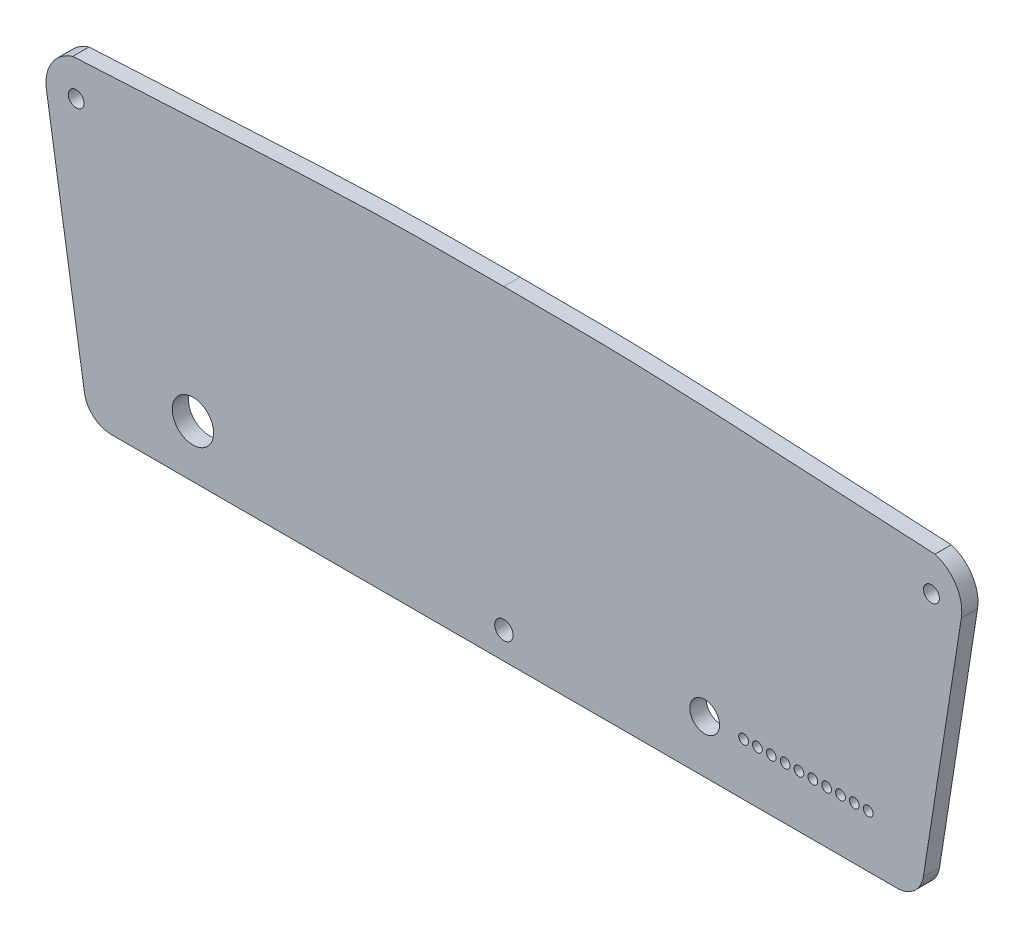
ISO-10303-21;
HEADER;
FILE_DESCRIPTION(('STEP AP214'),'2;1');
FILE_NAME('part.step','',(''),(''),'','','');
FILE_SCHEMA(('AUTOMOTIVE_DESIGN { 1 0 10303 214 1 1 1 1 }'));
ENDSEC;
DATA;
#1=APPLICATION_CONTEXT('core data for automotive mechanical design processes');
#2=APPLICATION_PROTOCOL_DEFINITION('international standard','automotive_design',2000,#1);
#3=PRODUCT_CONTEXT('',#1,'mechanical');
#4=PRODUCT('Part','Part','',(#3));
#5=PRODUCT_RELATED_PRODUCT_CATEGORY('part','',(#4));
#6=PRODUCT_DEFINITION_FORMATION('','',#4);
#7=PRODUCT_DEFINITION_CONTEXT('part definition',#1,'design');
#8=PRODUCT_DEFINITION('design','',#6,#7);
#9=PRODUCT_DEFINITION_SHAPE('','',#8);
#10=(LENGTH_UNIT() NAMED_UNIT(*) SI_UNIT(.MILLI.,.METRE.));
#11=(NAMED_UNIT(*) PLANE_ANGLE_UNIT() SI_UNIT($,.RADIAN.));
#12=(NAMED_UNIT(*) SI_UNIT($,.STERADIAN.) SOLID_ANGLE_UNIT());
#13=UNCERTAINTY_MEASURE_WITH_UNIT(LENGTH_MEASURE(1.E-05),#10,'distance_accuracy_value','');
#14=(GEOMETRIC_REPRESENTATION_CONTEXT(3) GLOBAL_UNCERTAINTY_ASSIGNED_CONTEXT((#13)) GLOBAL_UNIT_ASSIGNED_CONTEXT((#10,
#11,#12)) REPRESENTATION_CONTEXT('',''));
#15=CARTESIAN_POINT('',(0.,0.,0.));
#16=DIRECTION('',(0.,0.,1.));
#17=DIRECTION('',(1.,0.,0.));
#18=AXIS2_PLACEMENT_3D('',#15,#16,#17);
#19=CARTESIAN_POINT('',(77.6729384432531,7.59154105312176,0.));
#20=DIRECTION('',(0.,0.,1.));
#21=DIRECTION('',(1.,0.,0.));
#22=AXIS2_PLACEMENT_3D('',#19,#20,#21);
#23=PLANE('',#22);
#24=CARTESIAN_POINT('',(-57.4968243381377,-33.0147357689466,0.));
#25=DIRECTION('',(0.,0.,1.));
#26=DIRECTION('',(1.,0.,0.));
#27=AXIS2_PLACEMENT_3D('',#24,#25,#26);
#28=CIRCLE('',#27,3.825);
#29=CARTESIAN_POINT('',(-53.6718243381377,-33.0147357689466,0.));
#30=VERTEX_POINT('',#29);
#31=EDGE_CURVE('E336',#30,#30,#28,.T.);
#32=ORIENTED_EDGE('',*,*,#31,.T.);
#33=EDGE_LOOP('',(#32));
#34=FACE_BOUND('',#33,.T.);
#35=CARTESIAN_POINT('',(44.3221642694553,-33.0147357689466,0.));
#36=DIRECTION('',(0.,0.,-1.));
#37=DIRECTION('',(-1.,0.,0.));
#38=AXIS2_PLACEMENT_3D('',#35,#36,#37);
#39=CIRCLE('',#38,0.899999999999998);
#40=CARTESIAN_POINT('',(43.4221642694553,-33.0147357689466,0.));
#41=VERTEX_POINT('',#40);
#42=EDGE_CURVE('E333',#41,#41,#39,.T.);
#43=ORIENTED_EDGE('',*,*,#42,.F.);
#44=EDGE_LOOP('',(#43));
#45=FACE_BOUND('',#44,.T.);
#46=CARTESIAN_POINT('',(46.8821642694554,-33.0147357689466,0.));
#47=DIRECTION('',(0.,0.,-1.));
#48=DIRECTION('',(-1.,0.,0.));
#49=AXIS2_PLACEMENT_3D('',#46,#47,#48);
#50=CIRCLE('',#49,0.899999999999998);
#51=CARTESIAN_POINT('',(45.9821642694554,-33.0147357689466,0.));
#52=VERTEX_POINT('',#51);
#53=EDGE_CURVE('E327',#52,#52,#50,.T.);
#54=ORIENTED_EDGE('',*,*,#53,.F.);
#55=EDGE_LOOP('',(#54));
#56=FACE_BOUND('',#55,.T.);
#57=CARTESIAN_POINT('',(52.0021642694553,-33.0147357689466,0.));
#58=DIRECTION('',(0.,0.,-1.));
#59=DIRECTION('',(-1.,0.,0.));
#60=AXIS2_PLACEMENT_3D('',#57,#58,#59);
#61=CIRCLE('',#60,0.899999999999998);
#62=CARTESIAN_POINT('',(51.1021642694553,-33.0147357689466,0.));
#63=VERTEX_POINT('',#62);
#64=EDGE_CURVE('E315',#63,#63,#61,.T.);
#65=ORIENTED_EDGE('',*,*,#64,.F.);
#66=EDGE_LOOP('',(#65));
#67=FACE_BOUND('',#66,.T.);
#68=CARTESIAN_POINT('',(54.5621642694553,-33.0147357689466,0.));
#69=DIRECTION('',(0.,0.,-1.));
#70=DIRECTION('',(-1.,0.,0.));
#71=AXIS2_PLACEMENT_3D('',#68,#69,#70);
#72=CIRCLE('',#71,0.899999999999998);
#73=CARTESIAN_POINT('',(53.6621642694553,-33.0147357689466,0.));
#74=VERTEX_POINT('',#73);
#75=EDGE_CURVE('E309',#74,#74,#72,.T.);
#76=ORIENTED_EDGE('',*,*,#75,.F.);
#77=EDGE_LOOP('',(#76));
#78=FACE_BOUND('',#77,.T.);
#79=CARTESIAN_POINT('',(57.1221642694553,-33.0147357689466,0.));
#80=DIRECTION('',(0.,0.,-1.));
#81=DIRECTION('',(-1.,0.,0.));
#82=AXIS2_PLACEMENT_3D('',#79,#80,#81);
#83=CIRCLE('',#82,0.899999999999998);
#84=CARTESIAN_POINT('',(56.2221642694554,-33.0147357689466,0.));
#85=VERTEX_POINT('',#84);
#86=EDGE_CURVE('E303',#85,#85,#83,.T.);
#87=ORIENTED_EDGE('',*,*,#86,.F.);
#88=EDGE_LOOP('',(#87));
#89=FACE_BOUND('',#88,.T.);
#90=CARTESIAN_POINT('',(59.6821642694553,-33.0147357689466,0.));
#91=DIRECTION('',(0.,0.,-1.));
#92=DIRECTION('',(-1.,0.,0.));
#93=AXIS2_PLACEMENT_3D('',#90,#91,#92);
#94=CIRCLE('',#93,0.899999999999998);
#95=CARTESIAN_POINT('',(58.7821642694554,-33.0147357689466,0.));
#96=VERTEX_POINT('',#95);
#97=EDGE_CURVE('E297',#96,#96,#94,.T.);
#98=ORIENTED_EDGE('',*,*,#97,.F.);
#99=EDGE_LOOP('',(#98));
#100=FACE_BOUND('',#99,.T.);
#101=CARTESIAN_POINT('',(62.2421642694554,-33.0147357689466,0.));
#102=DIRECTION('',(0.,0.,-1.));
#103=DIRECTION('',(-1.,0.,0.));
#104=AXIS2_PLACEMENT_3D('',#101,#102,#103);
#105=CIRCLE('',#104,0.900000000000005);
#106=CARTESIAN_POINT('',(61.3421642694554,-33.0147357689466,0.));
#107=VERTEX_POINT('',#106);
#108=EDGE_CURVE('E291',#107,#107,#105,.T.);
#109=ORIENTED_EDGE('',*,*,#108,.F.);
#110=EDGE_LOOP('',(#109));
#111=FACE_BOUND('',#110,.T.);
#112=CARTESIAN_POINT('',(67.3621642694553,-33.0147357689466,0.));
#113=DIRECTION('',(0.,0.,-1.));
#114=DIRECTION('',(-1.,0.,0.));
#115=AXIS2_PLACEMENT_3D('',#112,#113,#114);
#116=CIRCLE('',#115,0.899999999999998);
#117=CARTESIAN_POINT('',(66.4621642694554,-33.0147357689466,0.));
#118=VERTEX_POINT('',#117);
#119=EDGE_CURVE('E279',#118,#118,#116,.T.);
#120=ORIENTED_EDGE('',*,*,#119,.F.);
#121=EDGE_LOOP('',(#120));
#122=FACE_BOUND('',#121,.T.);
#123=CARTESIAN_POINT('',(37.1256647541517,-33.0147357689466,0.));
#124=DIRECTION('',(0.,0.,-1.));
#125=DIRECTION('',(-1.,0.,0.));
#126=AXIS2_PLACEMENT_3D('',#123,#124,#125);
#127=CIRCLE('',#126,2.75);
#128=CARTESIAN_POINT('',(34.3756647541517,-33.0147357689466,0.));
#129=VERTEX_POINT('',#128);
#130=EDGE_CURVE('E273',#129,#129,#127,.T.);
#131=ORIENTED_EDGE('',*,*,#130,.F.);
#132=EDGE_LOOP('',(#131));
#133=FACE_BOUND('',#132,.T.);
#134=CARTESIAN_POINT('',(-79.0964854551997,7.80060452720228,0.));
#135=DIRECTION('',(0.,0.,-1.));
#136=DIRECTION('',(-1.,0.,0.));
#137=AXIS2_PLACEMENT_3D('',#134,#135,#136);
#138=CIRCLE('',#137,1.46049999999999);
#139=CARTESIAN_POINT('',(-80.5569854551997,7.80060452720228,0.));
#140=VERTEX_POINT('',#139);
#141=EDGE_CURVE('E261',#140,#140,#138,.T.);
#142=ORIENTED_EDGE('',*,*,#141,.F.);
#143=EDGE_LOOP('',(#142));
#144=FACE_BOUND('',#143,.T.);
#145=CARTESIAN_POINT('',(79.0662246228495,7.60685909853357,0.));
#146=DIRECTION('',(0.,0.,-1.));
#147=DIRECTION('',(-1.,0.,0.));
#148=AXIS2_PLACEMENT_3D('',#145,#146,#147);
#149=CIRCLE('',#148,1.46049999999999);
#150=CARTESIAN_POINT('',(77.6057246228496,7.60685909853357,0.));
#151=VERTEX_POINT('',#150);
#152=EDGE_CURVE('E255',#151,#151,#149,.T.);
#153=ORIENTED_EDGE('',*,*,#152,.F.);
#154=EDGE_LOOP('',(#153));
#155=FACE_BOUND('',#154,.T.);
#156=CARTESIAN_POINT('',(77.6729384432531,7.59154105312176,0.));
#157=DIRECTION('',(0.,0.,1.));
#158=DIRECTION('',(1.,0.,0.));
#159=AXIS2_PLACEMENT_3D('',#156,#157,#158);
#160=CIRCLE('',#159,7.);
#161=CARTESIAN_POINT('',(84.5890874100609,6.51131724810564,0.));
#162=VERTEX_POINT('',#161);
#163=CARTESIAN_POINT('',(79.7182282278267,14.2860753683015,0.));
#164=VERTEX_POINT('',#163);
#165=EDGE_CURVE('E136',#162,#164,#160,.T.);
#166=ORIENTED_EDGE('',*,*,#165,.F.);
#167=DIRECTION('',(0.154317686430875,0.988021280972542,0.));
#168=VECTOR('',#167,1.);
#169=CARTESIAN_POINT('',(77.5610943048627,-38.4855130638528,0.));
#170=LINE('',#169,#168);
#171=CARTESIAN_POINT('',(77.5610943048627,-38.4855130638528,0.));
#172=VERTEX_POINT('',#171);
#173=EDGE_CURVE('E84',#172,#162,#170,.T.);
#174=ORIENTED_EDGE('',*,*,#173,.F.);
#175=CARTESIAN_POINT('',(72.6209879,-37.7139246316985,0.));
#176=DIRECTION('',(0.,0.,-1.));
#177=DIRECTION('',(-1.,0.,0.));
#178=AXIS2_PLACEMENT_3D('',#175,#176,#177);
#179=CIRCLE('',#178,5.00000000000001);
#180=CARTESIAN_POINT('',(72.6209879,-42.7139246316985,0.));
#181=VERTEX_POINT('',#180);
#182=EDGE_CURVE('E166',#172,#181,#179,.T.);
#183=ORIENTED_EDGE('',*,*,#182,.T.);
#184=DIRECTION('',(-1.,0.,0.));
#185=VECTOR('',#184,1.);
#186=CARTESIAN_POINT('',(72.6209879,-42.7139246316985,0.));
#187=LINE('',#186,#185);
#188=CARTESIAN_POINT('',(-72.6209879,-42.7139246316985,0.));
#189=VERTEX_POINT('',#188);
#190=EDGE_CURVE('E115',#181,#189,#187,.T.);
#191=ORIENTED_EDGE('',*,*,#190,.T.);
#192=CARTESIAN_POINT('',(-72.6209879,-37.7139246316985,0.));
#193=DIRECTION('',(0.,0.,1.));
#194=DIRECTION('',(1.,0.,0.));
#195=AXIS2_PLACEMENT_3D('',#192,#193,#194);
#196=CIRCLE('',#195,5.00000000000001);
#197=CARTESIAN_POINT('',(-77.5610943048627,-38.4855130638528,0.));
#198=VERTEX_POINT('',#197);
#199=EDGE_CURVE('E162',#198,#189,#196,.T.);
#200=ORIENTED_EDGE('',*,*,#199,.F.);
#201=DIRECTION('',(-0.154317686430875,0.988021280972542,0.));
#202=VECTOR('',#201,1.);
#203=CARTESIAN_POINT('',(-77.5610943048627,-38.4855130638528,0.));
#204=LINE('',#203,#202);
#205=CARTESIAN_POINT('',(-84.5890874100609,6.51131724810564,0.));
#206=VERTEX_POINT('',#205);
#207=EDGE_CURVE('E159',#198,#206,#204,.T.);
#208=ORIENTED_EDGE('',*,*,#207,.T.);
#209=CARTESIAN_POINT('',(-77.6729384432531,7.59154105312176,0.));
#210=DIRECTION('',(0.,0.,-1.));
#211=DIRECTION('',(-1.,0.,0.));
#212=AXIS2_PLACEMENT_3D('',#209,#210,#211);
#213=CIRCLE('',#212,7.);
#214=CARTESIAN_POINT('',(-79.7182282278267,14.2860753683015,0.));
#215=VERTEX_POINT('',#214);
#216=EDGE_CURVE('E153',#206,#215,#213,.T.);
#217=ORIENTED_EDGE('',*,*,#216,.T.);
#218=CARTESIAN_POINT('',(-79.7182282278267,14.2860753683015,0.));
#219=CARTESIAN_POINT('',(-25.,17.2860753683015,0.));
#220=CARTESIAN_POINT('',(0.,17.2860753683015,0.));
#221=(BOUNDED_CURVE() B_SPLINE_CURVE(2,(#218,#219,#220),.UNSPECIFIED.,.F.,
.F.) B_SPLINE_CURVE_WITH_KNOTS((3,3),(0.,1.),
.UNSPECIFIED.) CURVE() GEOMETRIC_REPRESENTATION_ITEM() RATIONAL_B_SPLINE_CURVE((1.,3.,1.)) REPRESENTATION_ITEM(''));
#222=CARTESIAN_POINT('',(0.,17.2860753683015,0.));
#223=VERTEX_POINT('',#222);
#224=EDGE_CURVE('E145',#215,#223,#221,.T.);
#225=ORIENTED_EDGE('',*,*,#224,.T.);
#226=CARTESIAN_POINT('',(79.7182282278267,14.2860753683015,0.));
#227=CARTESIAN_POINT('',(25.,17.2860753683015,0.));
#228=CARTESIAN_POINT('',(0.,17.2860753683015,0.));
#229=(BOUNDED_CURVE() B_SPLINE_CURVE(2,(#226,#227,#228),.UNSPECIFIED.,.F.,
.F.) B_SPLINE_CURVE_WITH_KNOTS((3,3),(0.,1.),
.UNSPECIFIED.) CURVE() GEOMETRIC_REPRESENTATION_ITEM() RATIONAL_B_SPLINE_CURVE((1.,3.,1.)) REPRESENTATION_ITEM(''));
#230=EDGE_CURVE('E139',#164,#223,#229,.T.);
#231=ORIENTED_EDGE('',*,*,#230,.F.);
#232=EDGE_LOOP('',(#166,#174,#183,#191,#200,#208,#217,#225,#231));
#233=FACE_BOUND('',#232,.T.);
#234=CARTESIAN_POINT('',(0.,-37.7139246316985,0.));
#235=DIRECTION('',(0.,0.,-1.));
#236=DIRECTION('',(-1.,0.,0.));
#237=AXIS2_PLACEMENT_3D('',#234,#235,#236);
#238=CIRCLE('',#237,1.7);
#239=CARTESIAN_POINT('',(-1.7,-37.7139246316985,0.));
#240=VERTEX_POINT('',#239);
#241=EDGE_CURVE('E267',#240,#240,#238,.T.);
#242=ORIENTED_EDGE('',*,*,#241,.F.);
#243=EDGE_LOOP('',(#242));
#244=FACE_BOUND('',#243,.T.);
#245=CARTESIAN_POINT('',(64.8021642694553,-33.0147357689466,0.));
#246=DIRECTION('',(0.,0.,-1.));
#247=DIRECTION('',(-1.,0.,0.));
#248=AXIS2_PLACEMENT_3D('',#245,#246,#247);
#249=CIRCLE('',#248,0.899999999999998);
#250=CARTESIAN_POINT('',(63.9021642694553,-33.0147357689466,0.));
#251=VERTEX_POINT('',#250);
#252=EDGE_CURVE('E285',#251,#251,#249,.T.);
#253=ORIENTED_EDGE('',*,*,#252,.F.);
#254=EDGE_LOOP('',(#253));
#255=FACE_BOUND('',#254,.T.);
#256=CARTESIAN_POINT('',(49.4421642694553,-33.0147357689466,0.));
#257=DIRECTION('',(0.,0.,-1.));
#258=DIRECTION('',(-1.,0.,0.));
#259=AXIS2_PLACEMENT_3D('',#256,#257,#258);
#260=CIRCLE('',#259,0.899999999999998);
#261=CARTESIAN_POINT('',(48.5421642694553,-33.0147357689466,0.));
#262=VERTEX_POINT('',#261);
#263=EDGE_CURVE('E321',#262,#262,#260,.T.);
#264=ORIENTED_EDGE('',*,*,#263,.F.);
#265=EDGE_LOOP('',(#264));
#266=FACE_BOUND('',#265,.T.);
#267=ADVANCED_FACE('F33',(#34,#45,#56,#67,#78,#89,#100,#111,#122,#133,#144,#155,#233,#244,#255,
#266),#23,.F.);
#268=CARTESIAN_POINT('',(77.6729384432531,7.59154105312176,3.));
#269=DIRECTION('',(0.,0.,1.));
#270=DIRECTION('',(1.,0.,0.));
#271=AXIS2_PLACEMENT_3D('',#268,#269,#270);
#272=PLANE('',#271);
#273=CARTESIAN_POINT('',(-57.4968243381377,-33.0147357689466,3.));
#274=DIRECTION('',(0.,0.,1.));
#275=DIRECTION('',(1.,0.,0.));
#276=AXIS2_PLACEMENT_3D('',#273,#274,#275);
#277=CIRCLE('',#276,3.825);
#278=CARTESIAN_POINT('',(-53.6718243381377,-33.0147357689466,3.));
#279=VERTEX_POINT('',#278);
#280=EDGE_CURVE('E338',#279,#279,#277,.T.);
#281=ORIENTED_EDGE('',*,*,#280,.F.);
#282=EDGE_LOOP('',(#281));
#283=FACE_BOUND('',#282,.T.);
#284=CARTESIAN_POINT('',(44.3221642694553,-33.0147357689466,3.));
#285=DIRECTION('',(0.,0.,-1.));
#286=DIRECTION('',(-1.,0.,0.));
#287=AXIS2_PLACEMENT_3D('',#284,#285,#286);
#288=CIRCLE('',#287,0.899999999999998);
#289=CARTESIAN_POINT('',(43.4221642694553,-33.0147357689466,3.));
#290=VERTEX_POINT('',#289);
#291=EDGE_CURVE('E330',#290,#290,#288,.T.);
#292=ORIENTED_EDGE('',*,*,#291,.T.);
#293=EDGE_LOOP('',(#292));
#294=FACE_BOUND('',#293,.T.);
#295=CARTESIAN_POINT('',(46.8821642694554,-33.0147357689466,3.));
#296=DIRECTION('',(0.,0.,-1.));
#297=DIRECTION('',(-1.,0.,0.));
#298=AXIS2_PLACEMENT_3D('',#295,#296,#297);
#299=CIRCLE('',#298,0.899999999999998);
#300=CARTESIAN_POINT('',(45.9821642694554,-33.0147357689466,3.));
#301=VERTEX_POINT('',#300);
#302=EDGE_CURVE('E324',#301,#301,#299,.T.);
#303=ORIENTED_EDGE('',*,*,#302,.T.);
#304=EDGE_LOOP('',(#303));
#305=FACE_BOUND('',#304,.T.);
#306=CARTESIAN_POINT('',(49.4421642694553,-33.0147357689466,3.));
#307=DIRECTION('',(0.,0.,-1.));
#308=DIRECTION('',(-1.,0.,0.));
#309=AXIS2_PLACEMENT_3D('',#306,#307,#308);
#310=CIRCLE('',#309,0.899999999999998);
#311=CARTESIAN_POINT('',(48.5421642694553,-33.0147357689466,3.));
#312=VERTEX_POINT('',#311);
#313=EDGE_CURVE('E318',#312,#312,#310,.T.);
#314=ORIENTED_EDGE('',*,*,#313,.T.);
#315=EDGE_LOOP('',(#314));
#316=FACE_BOUND('',#315,.T.);
#317=CARTESIAN_POINT('',(67.3621642694553,-33.0147357689466,3.));
#318=DIRECTION('',(0.,0.,-1.));
#319=DIRECTION('',(-1.,0.,0.));
#320=AXIS2_PLACEMENT_3D('',#317,#318,#319);
#321=CIRCLE('',#320,0.899999999999998);
#322=CARTESIAN_POINT('',(66.4621642694554,-33.0147357689466,3.));
#323=VERTEX_POINT('',#322);
#324=EDGE_CURVE('E276',#323,#323,#321,.T.);
#325=ORIENTED_EDGE('',*,*,#324,.T.);
#326=EDGE_LOOP('',(#325));
#327=FACE_BOUND('',#326,.T.);
#328=CARTESIAN_POINT('',(37.1256647541517,-33.0147357689466,3.));
#329=DIRECTION('',(0.,0.,-1.));
#330=DIRECTION('',(-1.,0.,0.));
#331=AXIS2_PLACEMENT_3D('',#328,#329,#330);
#332=CIRCLE('',#331,2.75);
#333=CARTESIAN_POINT('',(34.3756647541517,-33.0147357689466,3.));
#334=VERTEX_POINT('',#333);
#335=EDGE_CURVE('E270',#334,#334,#332,.T.);
#336=ORIENTED_EDGE('',*,*,#335,.T.);
#337=EDGE_LOOP('',(#336));
#338=FACE_BOUND('',#337,.T.);
#339=CARTESIAN_POINT('',(0.,-37.7139246316985,3.));
#340=DIRECTION('',(0.,0.,-1.));
#341=DIRECTION('',(-1.,0.,0.));
#342=AXIS2_PLACEMENT_3D('',#339,#340,#341);
#343=CIRCLE('',#342,1.7);
#344=CARTESIAN_POINT('',(-1.7,-37.7139246316985,3.));
#345=VERTEX_POINT('',#344);
#346=EDGE_CURVE('E264',#345,#345,#343,.T.);
#347=ORIENTED_EDGE('',*,*,#346,.T.);
#348=EDGE_LOOP('',(#347));
#349=FACE_BOUND('',#348,.T.);
#350=CARTESIAN_POINT('',(-79.0964854551997,7.80060452720228,3.));
#351=DIRECTION('',(0.,0.,-1.));
#352=DIRECTION('',(-1.,0.,0.));
#353=AXIS2_PLACEMENT_3D('',#350,#351,#352);
#354=CIRCLE('',#353,1.46049999999999);
#355=CARTESIAN_POINT('',(-80.5569854551997,7.80060452720228,3.));
#356=VERTEX_POINT('',#355);
#357=EDGE_CURVE('E258',#356,#356,#354,.T.);
#358=ORIENTED_EDGE('',*,*,#357,.T.);
#359=EDGE_LOOP('',(#358));
#360=FACE_BOUND('',#359,.T.);
#361=CARTESIAN_POINT('',(79.0662246228495,7.60685909853357,3.));
#362=DIRECTION('',(0.,0.,-1.));
#363=DIRECTION('',(-1.,0.,0.));
#364=AXIS2_PLACEMENT_3D('',#361,#362,#363);
#365=CIRCLE('',#364,1.46049999999999);
#366=CARTESIAN_POINT('',(77.6057246228496,7.60685909853357,3.));
#367=VERTEX_POINT('',#366);
#368=EDGE_CURVE('E140',#367,#367,#365,.T.);
#369=ORIENTED_EDGE('',*,*,#368,.T.);
#370=EDGE_LOOP('',(#369));
#371=FACE_BOUND('',#370,.T.);
#372=CARTESIAN_POINT('',(77.6729384432531,7.59154105312176,3.));
#373=DIRECTION('',(0.,0.,1.));
#374=DIRECTION('',(1.,0.,0.));
#375=AXIS2_PLACEMENT_3D('',#372,#373,#374);
#376=CIRCLE('',#375,7.);
#377=CARTESIAN_POINT('',(84.5890874100609,6.51131724810564,3.));
#378=VERTEX_POINT('',#377);
#379=CARTESIAN_POINT('',(79.7182282278267,14.2860753683015,3.));
#380=VERTEX_POINT('',#379);
#381=EDGE_CURVE('E169',#378,#380,#376,.T.);
#382=ORIENTED_EDGE('',*,*,#381,.T.);
#383=CARTESIAN_POINT('',(79.7182282278267,14.2860753683015,3.));
#384=CARTESIAN_POINT('',(25.,17.2860753683015,3.));
#385=CARTESIAN_POINT('',(0.,17.2860753683015,3.));
#386=(BOUNDED_CURVE() B_SPLINE_CURVE(2,(#383,#384,#385),.UNSPECIFIED.,.F.,
.F.) B_SPLINE_CURVE_WITH_KNOTS((3,3),(0.,1.),
.UNSPECIFIED.) CURVE() GEOMETRIC_REPRESENTATION_ITEM() RATIONAL_B_SPLINE_CURVE((1.,3.,1.)) REPRESENTATION_ITEM(''));
#387=CARTESIAN_POINT('',(0.,17.2860753683015,3.));
#388=VERTEX_POINT('',#387);
#389=EDGE_CURVE('E92',#380,#388,#386,.T.);
#390=ORIENTED_EDGE('',*,*,#389,.T.);
#391=CARTESIAN_POINT('',(-79.7182282278267,14.2860753683015,3.));
#392=CARTESIAN_POINT('',(-25.,17.2860753683015,3.));
#393=CARTESIAN_POINT('',(0.,17.2860753683015,3.));
#394=(BOUNDED_CURVE() B_SPLINE_CURVE(2,(#391,#392,#393),.UNSPECIFIED.,.F.,
.F.) B_SPLINE_CURVE_WITH_KNOTS((3,3),(0.,1.),
.UNSPECIFIED.) CURVE() GEOMETRIC_REPRESENTATION_ITEM() RATIONAL_B_SPLINE_CURVE((1.,3.,1.)) REPRESENTATION_ITEM(''));
#395=CARTESIAN_POINT('',(-79.7182282278267,14.2860753683015,3.));
#396=VERTEX_POINT('',#395);
#397=EDGE_CURVE('E183',#396,#388,#394,.T.);
#398=ORIENTED_EDGE('',*,*,#397,.F.);
#399=CARTESIAN_POINT('',(-77.6729384432531,7.59154105312176,3.));
#400=DIRECTION('',(0.,0.,-1.));
#401=DIRECTION('',(-1.,0.,0.));
#402=AXIS2_PLACEMENT_3D('',#399,#400,#401);
#403=CIRCLE('',#402,7.);
#404=CARTESIAN_POINT('',(-84.5890874100609,6.51131724810564,3.));
#405=VERTEX_POINT('',#404);
#406=EDGE_CURVE('E196',#405,#396,#403,.T.);
#407=ORIENTED_EDGE('',*,*,#406,.F.);
#408=DIRECTION('',(-0.154317686430875,0.988021280972542,0.));
#409=VECTOR('',#408,1.);
#410=CARTESIAN_POINT('',(-77.5610943048627,-38.4855130638528,3.));
#411=LINE('',#410,#409);
#412=CARTESIAN_POINT('',(-77.5610943048627,-38.4855130638528,3.));
#413=VERTEX_POINT('',#412);
#414=EDGE_CURVE('E199',#413,#405,#411,.T.);
#415=ORIENTED_EDGE('',*,*,#414,.F.);
#416=CARTESIAN_POINT('',(-72.6209879,-37.7139246316985,3.));
#417=DIRECTION('',(0.,0.,1.));
#418=DIRECTION('',(1.,0.,0.));
#419=AXIS2_PLACEMENT_3D('',#416,#417,#418);
#420=CIRCLE('',#419,5.00000000000001);
#421=CARTESIAN_POINT('',(-72.6209879,-42.7139246316985,3.));
#422=VERTEX_POINT('',#421);
#423=EDGE_CURVE('E127',#413,#422,#420,.T.);
#424=ORIENTED_EDGE('',*,*,#423,.T.);
#425=DIRECTION('',(-1.,0.,0.));
#426=VECTOR('',#425,1.);
#427=CARTESIAN_POINT('',(72.6209879,-42.7139246316985,3.));
#428=LINE('',#427,#426);
#429=CARTESIAN_POINT('',(72.6209879,-42.7139246316985,3.));
#430=VERTEX_POINT('',#429);
#431=EDGE_CURVE('E113',#430,#422,#428,.T.);
#432=ORIENTED_EDGE('',*,*,#431,.F.);
#433=CARTESIAN_POINT('',(72.6209879,-37.7139246316985,3.));
#434=DIRECTION('',(0.,0.,-1.));
#435=DIRECTION('',(-1.,0.,0.));
#436=AXIS2_PLACEMENT_3D('',#433,#434,#435);
#437=CIRCLE('',#436,5.00000000000001);
#438=CARTESIAN_POINT('',(77.5610943048627,-38.4855130638528,3.));
#439=VERTEX_POINT('',#438);
#440=EDGE_CURVE('E124',#439,#430,#437,.T.);
#441=ORIENTED_EDGE('',*,*,#440,.F.);
#442=DIRECTION('',(0.154317686430875,0.988021280972542,0.));
#443=VECTOR('',#442,1.);
#444=CARTESIAN_POINT('',(77.5610943048627,-38.4855130638528,3.));
#445=LINE('',#444,#443);
#446=EDGE_CURVE('E50',#439,#378,#445,.T.);
#447=ORIENTED_EDGE('',*,*,#446,.T.);
#448=EDGE_LOOP('',(#382,#390,#398,#407,#415,#424,#432,#441,#447));
#449=FACE_BOUND('',#448,.T.);
#450=CARTESIAN_POINT('',(64.8021642694553,-33.0147357689466,3.));
#451=DIRECTION('',(0.,0.,-1.));
#452=DIRECTION('',(-1.,0.,0.));
#453=AXIS2_PLACEMENT_3D('',#450,#451,#452);
#454=CIRCLE('',#453,0.899999999999998);
#455=CARTESIAN_POINT('',(63.9021642694553,-33.0147357689466,3.));
#456=VERTEX_POINT('',#455);
#457=EDGE_CURVE('E282',#456,#456,#454,.T.);
#458=ORIENTED_EDGE('',*,*,#457,.T.);
#459=EDGE_LOOP('',(#458));
#460=FACE_BOUND('',#459,.T.);
#461=CARTESIAN_POINT('',(62.2421642694554,-33.0147357689466,3.));
#462=DIRECTION('',(0.,0.,-1.));
#463=DIRECTION('',(-1.,0.,0.));
#464=AXIS2_PLACEMENT_3D('',#461,#462,#463);
#465=CIRCLE('',#464,0.900000000000005);
#466=CARTESIAN_POINT('',(61.3421642694554,-33.0147357689466,3.));
#467=VERTEX_POINT('',#466);
#468=EDGE_CURVE('E288',#467,#467,#465,.T.);
#469=ORIENTED_EDGE('',*,*,#468,.T.);
#470=EDGE_LOOP('',(#469));
#471=FACE_BOUND('',#470,.T.);
#472=CARTESIAN_POINT('',(59.6821642694553,-33.0147357689466,3.));
#473=DIRECTION('',(0.,0.,-1.));
#474=DIRECTION('',(-1.,0.,0.));
#475=AXIS2_PLACEMENT_3D('',#472,#473,#474);
#476=CIRCLE('',#475,0.899999999999998);
#477=CARTESIAN_POINT('',(58.7821642694554,-33.0147357689466,3.));
#478=VERTEX_POINT('',#477);
#479=EDGE_CURVE('E294',#478,#478,#476,.T.);
#480=ORIENTED_EDGE('',*,*,#479,.T.);
#481=EDGE_LOOP('',(#480));
#482=FACE_BOUND('',#481,.T.);
#483=CARTESIAN_POINT('',(57.1221642694553,-33.0147357689466,3.));
#484=DIRECTION('',(0.,0.,-1.));
#485=DIRECTION('',(-1.,0.,0.));
#486=AXIS2_PLACEMENT_3D('',#483,#484,#485);
#487=CIRCLE('',#486,0.899999999999998);
#488=CARTESIAN_POINT('',(56.2221642694554,-33.0147357689466,3.));
#489=VERTEX_POINT('',#488);
#490=EDGE_CURVE('E300',#489,#489,#487,.T.);
#491=ORIENTED_EDGE('',*,*,#490,.T.);
#492=EDGE_LOOP('',(#491));
#493=FACE_BOUND('',#492,.T.);
#494=CARTESIAN_POINT('',(54.5621642694553,-33.0147357689466,3.));
#495=DIRECTION('',(0.,0.,-1.));
#496=DIRECTION('',(-1.,0.,0.));
#497=AXIS2_PLACEMENT_3D('',#494,#495,#496);
#498=CIRCLE('',#497,0.899999999999998);
#499=CARTESIAN_POINT('',(53.6621642694553,-33.0147357689466,3.));
#500=VERTEX_POINT('',#499);
#501=EDGE_CURVE('E306',#500,#500,#498,.T.);
#502=ORIENTED_EDGE('',*,*,#501,.T.);
#503=EDGE_LOOP('',(#502));
#504=FACE_BOUND('',#503,.T.);
#505=CARTESIAN_POINT('',(52.0021642694553,-33.0147357689466,3.));
#506=DIRECTION('',(0.,0.,-1.));
#507=DIRECTION('',(-1.,0.,0.));
#508=AXIS2_PLACEMENT_3D('',#505,#506,#507);
#509=CIRCLE('',#508,0.899999999999998);
#510=CARTESIAN_POINT('',(51.1021642694553,-33.0147357689466,3.));
#511=VERTEX_POINT('',#510);
#512=EDGE_CURVE('E312',#511,#511,#509,.T.);
#513=ORIENTED_EDGE('',*,*,#512,.T.);
#514=EDGE_LOOP('',(#513));
#515=FACE_BOUND('',#514,.T.);
#516=ADVANCED_FACE('F122',(#283,#294,#305,#316,#327,#338,#349,#360,#371,#449,#460,#471,#482,
#493,#504,#515),#272,.T.);
#517=CARTESIAN_POINT('',(77.6729384432531,7.59154105312176,3.));
#518=DIRECTION('',(0.,0.,-1.));
#519=DIRECTION('',(-1.,0.,0.));
#520=AXIS2_PLACEMENT_3D('',#517,#518,#519);
#521=CYLINDRICAL_SURFACE('',#520,7.);
#522=ORIENTED_EDGE('',*,*,#165,.T.);
#523=DIRECTION('',(0.,0.,-1.));
#524=VECTOR('',#523,1.);
#525=CARTESIAN_POINT('',(79.7182282278267,14.2860753683015,3.));
#526=LINE('',#525,#524);
#527=EDGE_CURVE('E11',#380,#164,#526,.T.);
#528=ORIENTED_EDGE('',*,*,#527,.F.);
#529=ORIENTED_EDGE('',*,*,#381,.F.);
#530=DIRECTION('',(0.,0.,-1.));
#531=VECTOR('',#530,1.);
#532=CARTESIAN_POINT('',(84.5890874100609,6.51131724810564,3.));
#533=LINE('',#532,#531);
#534=EDGE_CURVE('E132',#378,#162,#533,.T.);
#535=ORIENTED_EDGE('',*,*,#534,.T.);
#536=EDGE_LOOP('',(#522,#528,#529,#535));
#537=FACE_BOUND('',#536,.T.);
#538=ADVANCED_FACE('F35',(#537),#521,.T.);
#539=DIRECTION('',(0.,0.,-1.));
#540=VECTOR('',#539,1.);
#541=SURFACE_OF_LINEAR_EXTRUSION('',#386,#540);
#542=ORIENTED_EDGE('',*,*,#230,.T.);
#543=DIRECTION('',(0.,0.,-1.));
#544=VECTOR('',#543,1.);
#545=CARTESIAN_POINT('',(0.,17.2860753683015,3.));
#546=LINE('',#545,#544);
#547=EDGE_CURVE('E42',#388,#223,#546,.T.);
#548=ORIENTED_EDGE('',*,*,#547,.F.);
#549=ORIENTED_EDGE('',*,*,#389,.F.);
#550=ORIENTED_EDGE('',*,*,#527,.T.);
#551=EDGE_LOOP('',(#542,#548,#549,#550));
#552=FACE_BOUND('',#551,.T.);
#553=ADVANCED_FACE('F184',(#552),#541,.F.);
#554=DIRECTION('',(0.,0.,-1.));
#555=VECTOR('',#554,1.);
#556=SURFACE_OF_LINEAR_EXTRUSION('',#394,#555);
#557=ORIENTED_EDGE('',*,*,#224,.F.);
#558=DIRECTION('',(0.,0.,-1.));
#559=VECTOR('',#558,1.);
#560=CARTESIAN_POINT('',(-79.7182282278267,14.2860753683015,3.));
#561=LINE('',#560,#559);
#562=EDGE_CURVE('E177',#396,#215,#561,.T.);
#563=ORIENTED_EDGE('',*,*,#562,.F.);
#564=ORIENTED_EDGE('',*,*,#397,.T.);
#565=ORIENTED_EDGE('',*,*,#547,.T.);
#566=EDGE_LOOP('',(#557,#563,#564,#565));
#567=FACE_BOUND('',#566,.T.);
#568=ADVANCED_FACE('F181',(#567),#556,.T.);
#569=CARTESIAN_POINT('',(-77.6729384432531,7.59154105312176,3.));
#570=DIRECTION('',(0.,0.,-1.));
#571=DIRECTION('',(-1.,0.,0.));
#572=AXIS2_PLACEMENT_3D('',#569,#570,#571);
#573=CYLINDRICAL_SURFACE('',#572,7.);
#574=ORIENTED_EDGE('',*,*,#216,.F.);
#575=DIRECTION('',(0.,0.,-1.));
#576=VECTOR('',#575,1.);
#577=CARTESIAN_POINT('',(-84.5890874100609,6.51131724810564,3.));
#578=LINE('',#577,#576);
#579=EDGE_CURVE('E175',#405,#206,#578,.T.);
#580=ORIENTED_EDGE('',*,*,#579,.F.);
#581=ORIENTED_EDGE('',*,*,#406,.T.);
#582=ORIENTED_EDGE('',*,*,#562,.T.);
#583=EDGE_LOOP('',(#574,#580,#581,#582));
#584=FACE_BOUND('',#583,.T.);
#585=ADVANCED_FACE('F193',(#584),#573,.T.);
#586=CARTESIAN_POINT('',(-77.5610943048627,-38.4855130638528,3.));
#587=DIRECTION('',(-0.988021280972542,-0.154317686430875,0.));
#588=DIRECTION('',(0.154317686430875,-0.988021280972542,0.));
#589=AXIS2_PLACEMENT_3D('',#586,#587,#588);
#590=PLANE('',#589);
#591=ORIENTED_EDGE('',*,*,#207,.F.);
#592=DIRECTION('',(0.,0.,-1.));
#593=VECTOR('',#592,1.);
#594=CARTESIAN_POINT('',(-77.5610943048627,-38.4855130638528,3.));
#595=LINE('',#594,#593);
#596=EDGE_CURVE('E173',#413,#198,#595,.T.);
#597=ORIENTED_EDGE('',*,*,#596,.F.);
#598=ORIENTED_EDGE('',*,*,#414,.T.);
#599=ORIENTED_EDGE('',*,*,#579,.T.);
#600=EDGE_LOOP('',(#591,#597,#598,#599));
#601=FACE_BOUND('',#600,.T.);
#602=ADVANCED_FACE('F244',(#601),#590,.T.);
#603=CARTESIAN_POINT('',(-72.6209879,-37.7139246316985,3.));
#604=DIRECTION('',(0.,0.,-1.));
#605=DIRECTION('',(-1.,0.,0.));
#606=AXIS2_PLACEMENT_3D('',#603,#604,#605);
#607=CYLINDRICAL_SURFACE('',#606,5.00000000000001);
#608=ORIENTED_EDGE('',*,*,#199,.T.);
#609=DIRECTION('',(0.,0.,-1.));
#610=VECTOR('',#609,1.);
#611=CARTESIAN_POINT('',(-72.6209879,-42.7139246316985,3.));
#612=LINE('',#611,#610);
#613=EDGE_CURVE('E120',#422,#189,#612,.T.);
#614=ORIENTED_EDGE('',*,*,#613,.F.);
#615=ORIENTED_EDGE('',*,*,#423,.F.);
#616=ORIENTED_EDGE('',*,*,#596,.T.);
#617=EDGE_LOOP('',(#608,#614,#615,#616));
#618=FACE_BOUND('',#617,.T.);
#619=ADVANCED_FACE('F242',(#618),#607,.T.);
#620=CARTESIAN_POINT('',(72.6209879,-42.7139246316985,3.));
#621=DIRECTION('',(0.,-1.,0.));
#622=DIRECTION('',(0.,0.,-1.));
#623=AXIS2_PLACEMENT_3D('',#620,#621,#622);
#624=PLANE('',#623);
#625=ORIENTED_EDGE('',*,*,#190,.F.);
#626=DIRECTION('',(0.,0.,-1.));
#627=VECTOR('',#626,1.);
#628=CARTESIAN_POINT('',(72.6209879,-42.7139246316985,3.));
#629=LINE('',#628,#627);
#630=EDGE_CURVE('E110',#430,#181,#629,.T.);
#631=ORIENTED_EDGE('',*,*,#630,.F.);
#632=ORIENTED_EDGE('',*,*,#431,.T.);
#633=ORIENTED_EDGE('',*,*,#613,.T.);
#634=EDGE_LOOP('',(#625,#631,#632,#633));
#635=FACE_BOUND('',#634,.T.);
#636=ADVANCED_FACE('F112',(#635),#624,.T.);
#637=CARTESIAN_POINT('',(72.6209879,-37.7139246316985,3.));
#638=DIRECTION('',(0.,0.,-1.));
#639=DIRECTION('',(-1.,0.,0.));
#640=AXIS2_PLACEMENT_3D('',#637,#638,#639);
#641=CYLINDRICAL_SURFACE('',#640,5.00000000000001);
#642=ORIENTED_EDGE('',*,*,#182,.F.);
#643=DIRECTION('',(0.,0.,-1.));
#644=VECTOR('',#643,1.);
#645=CARTESIAN_POINT('',(77.5610943048627,-38.4855130638528,3.));
#646=LINE('',#645,#644);
#647=EDGE_CURVE('E81',#439,#172,#646,.T.);
#648=ORIENTED_EDGE('',*,*,#647,.F.);
#649=ORIENTED_EDGE('',*,*,#440,.T.);
#650=ORIENTED_EDGE('',*,*,#630,.T.);
#651=EDGE_LOOP('',(#642,#648,#649,#650));
#652=FACE_BOUND('',#651,.T.);
#653=ADVANCED_FACE('F130',(#652),#641,.T.);
#654=CARTESIAN_POINT('',(77.5610943048627,-38.4855130638528,3.));
#655=DIRECTION('',(-0.988021280972542,0.154317686430875,0.));
#656=DIRECTION('',(-0.154317686430875,-0.988021280972542,0.));
#657=AXIS2_PLACEMENT_3D('',#654,#655,#656);
#658=PLANE('',#657);
#659=ORIENTED_EDGE('',*,*,#173,.T.);
#660=ORIENTED_EDGE('',*,*,#534,.F.);
#661=ORIENTED_EDGE('',*,*,#446,.F.);
#662=ORIENTED_EDGE('',*,*,#647,.T.);
#663=EDGE_LOOP('',(#659,#660,#661,#662));
#664=FACE_BOUND('',#663,.T.);
#665=ADVANCED_FACE('F234',(#664),#658,.F.);
#666=CARTESIAN_POINT('',(79.0662246228495,7.60685909853357,0.));
#667=DIRECTION('',(0.,0.,-1.));
#668=DIRECTION('',(-1.,0.,0.));
#669=AXIS2_PLACEMENT_3D('',#666,#667,#668);
#670=CYLINDRICAL_SURFACE('',#669,1.46049999999999);
#671=ORIENTED_EDGE('',*,*,#368,.F.);
#672=EDGE_LOOP('',(#671));
#673=FACE_BOUND('',#672,.T.);
#674=ORIENTED_EDGE('',*,*,#152,.T.);
#675=EDGE_LOOP('',(#674));
#676=FACE_BOUND('',#675,.T.);
#677=ADVANCED_FACE('F237',(#673,#676),#670,.F.);
#678=CARTESIAN_POINT('',(-79.0964854551997,7.80060452720228,0.));
#679=DIRECTION('',(0.,0.,-1.));
#680=DIRECTION('',(-1.,0.,0.));
#681=AXIS2_PLACEMENT_3D('',#678,#679,#680);
#682=CYLINDRICAL_SURFACE('',#681,1.46049999999999);
#683=ORIENTED_EDGE('',*,*,#357,.F.);
#684=EDGE_LOOP('',(#683));
#685=FACE_BOUND('',#684,.T.);
#686=ORIENTED_EDGE('',*,*,#141,.T.);
#687=EDGE_LOOP('',(#686));
#688=FACE_BOUND('',#687,.T.);
#689=ADVANCED_FACE('F363',(#685,#688),#682,.F.);
#690=CARTESIAN_POINT('',(0.,-37.7139246316985,0.));
#691=DIRECTION('',(0.,0.,-1.));
#692=DIRECTION('',(-1.,0.,0.));
#693=AXIS2_PLACEMENT_3D('',#690,#691,#692);
#694=CYLINDRICAL_SURFACE('',#693,1.7);
#695=ORIENTED_EDGE('',*,*,#346,.F.);
#696=EDGE_LOOP('',(#695));
#697=FACE_BOUND('',#696,.T.);
#698=ORIENTED_EDGE('',*,*,#241,.T.);
#699=EDGE_LOOP('',(#698));
#700=FACE_BOUND('',#699,.T.);
#701=ADVANCED_FACE('F369',(#697,#700),#694,.F.);
#702=CARTESIAN_POINT('',(37.1256647541517,-33.0147357689466,0.));
#703=DIRECTION('',(0.,0.,-1.));
#704=DIRECTION('',(-1.,0.,0.));
#705=AXIS2_PLACEMENT_3D('',#702,#703,#704);
#706=CYLINDRICAL_SURFACE('',#705,2.75);
#707=ORIENTED_EDGE('',*,*,#335,.F.);
#708=EDGE_LOOP('',(#707));
#709=FACE_BOUND('',#708,.T.);
#710=ORIENTED_EDGE('',*,*,#130,.T.);
#711=EDGE_LOOP('',(#710));
#712=FACE_BOUND('',#711,.T.);
#713=ADVANCED_FACE('F375',(#709,#712),#706,.F.);
#714=CARTESIAN_POINT('',(67.3621642694553,-33.0147357689466,0.));
#715=DIRECTION('',(0.,0.,-1.));
#716=DIRECTION('',(-1.,0.,0.));
#717=AXIS2_PLACEMENT_3D('',#714,#715,#716);
#718=CYLINDRICAL_SURFACE('',#717,0.899999999999998);
#719=ORIENTED_EDGE('',*,*,#324,.F.);
#720=EDGE_LOOP('',(#719));
#721=FACE_BOUND('',#720,.T.);
#722=ORIENTED_EDGE('',*,*,#119,.T.);
#723=EDGE_LOOP('',(#722));
#724=FACE_BOUND('',#723,.T.);
#725=ADVANCED_FACE('F379',(#721,#724),#718,.F.);
#726=CARTESIAN_POINT('',(64.8021642694553,-33.0147357689466,0.));
#727=DIRECTION('',(0.,0.,-1.));
#728=DIRECTION('',(-1.,0.,0.));
#729=AXIS2_PLACEMENT_3D('',#726,#727,#728);
#730=CYLINDRICAL_SURFACE('',#729,0.899999999999998);
#731=ORIENTED_EDGE('',*,*,#457,.F.);
#732=EDGE_LOOP('',(#731));
#733=FACE_BOUND('',#732,.T.);
#734=ORIENTED_EDGE('',*,*,#252,.T.);
#735=EDGE_LOOP('',(#734));
#736=FACE_BOUND('',#735,.T.);
#737=ADVANCED_FACE('F383',(#733,#736),#730,.F.);
#738=CARTESIAN_POINT('',(62.2421642694554,-33.0147357689466,0.));
#739=DIRECTION('',(0.,0.,-1.));
#740=DIRECTION('',(-1.,0.,0.));
#741=AXIS2_PLACEMENT_3D('',#738,#739,#740);
#742=CYLINDRICAL_SURFACE('',#741,0.900000000000005);
#743=ORIENTED_EDGE('',*,*,#468,.F.);
#744=EDGE_LOOP('',(#743));
#745=FACE_BOUND('',#744,.T.);
#746=ORIENTED_EDGE('',*,*,#108,.T.);
#747=EDGE_LOOP('',(#746));
#748=FACE_BOUND('',#747,.T.);
#749=ADVANCED_FACE('F387',(#745,#748),#742,.F.);
#750=CARTESIAN_POINT('',(59.6821642694553,-33.0147357689466,0.));
#751=DIRECTION('',(0.,0.,-1.));
#752=DIRECTION('',(-1.,0.,0.));
#753=AXIS2_PLACEMENT_3D('',#750,#751,#752);
#754=CYLINDRICAL_SURFACE('',#753,0.899999999999998);
#755=ORIENTED_EDGE('',*,*,#479,.F.);
#756=EDGE_LOOP('',(#755));
#757=FACE_BOUND('',#756,.T.);
#758=ORIENTED_EDGE('',*,*,#97,.T.);
#759=EDGE_LOOP('',(#758));
#760=FACE_BOUND('',#759,.T.);
#761=ADVANCED_FACE('F391',(#757,#760),#754,.F.);
#762=CARTESIAN_POINT('',(57.1221642694553,-33.0147357689466,0.));
#763=DIRECTION('',(0.,0.,-1.));
#764=DIRECTION('',(-1.,0.,0.));
#765=AXIS2_PLACEMENT_3D('',#762,#763,#764);
#766=CYLINDRICAL_SURFACE('',#765,0.899999999999998);
#767=ORIENTED_EDGE('',*,*,#490,.F.);
#768=EDGE_LOOP('',(#767));
#769=FACE_BOUND('',#768,.T.);
#770=ORIENTED_EDGE('',*,*,#86,.T.);
#771=EDGE_LOOP('',(#770));
#772=FACE_BOUND('',#771,.T.);
#773=ADVANCED_FACE('F395',(#769,#772),#766,.F.);
#774=CARTESIAN_POINT('',(54.5621642694553,-33.0147357689466,0.));
#775=DIRECTION('',(0.,0.,-1.));
#776=DIRECTION('',(-1.,0.,0.));
#777=AXIS2_PLACEMENT_3D('',#774,#775,#776);
#778=CYLINDRICAL_SURFACE('',#777,0.899999999999998);
#779=ORIENTED_EDGE('',*,*,#501,.F.);
#780=EDGE_LOOP('',(#779));
#781=FACE_BOUND('',#780,.T.);
#782=ORIENTED_EDGE('',*,*,#75,.T.);
#783=EDGE_LOOP('',(#782));
#784=FACE_BOUND('',#783,.T.);
#785=ADVANCED_FACE('F399',(#781,#784),#778,.F.);
#786=CARTESIAN_POINT('',(52.0021642694553,-33.0147357689466,0.));
#787=DIRECTION('',(0.,0.,-1.));
#788=DIRECTION('',(-1.,0.,0.));
#789=AXIS2_PLACEMENT_3D('',#786,#787,#788);
#790=CYLINDRICAL_SURFACE('',#789,0.899999999999998);
#791=ORIENTED_EDGE('',*,*,#512,.F.);
#792=EDGE_LOOP('',(#791));
#793=FACE_BOUND('',#792,.T.);
#794=ORIENTED_EDGE('',*,*,#64,.T.);
#795=EDGE_LOOP('',(#794));
#796=FACE_BOUND('',#795,.T.);
#797=ADVANCED_FACE('F403',(#793,#796),#790,.F.);
#798=CARTESIAN_POINT('',(49.4421642694553,-33.0147357689466,0.));
#799=DIRECTION('',(0.,0.,-1.));
#800=DIRECTION('',(-1.,0.,0.));
#801=AXIS2_PLACEMENT_3D('',#798,#799,#800);
#802=CYLINDRICAL_SURFACE('',#801,0.899999999999998);
#803=ORIENTED_EDGE('',*,*,#313,.F.);
#804=EDGE_LOOP('',(#803));
#805=FACE_BOUND('',#804,.T.);
#806=ORIENTED_EDGE('',*,*,#263,.T.);
#807=EDGE_LOOP('',(#806));
#808=FACE_BOUND('',#807,.T.);
#809=ADVANCED_FACE('F407',(#805,#808),#802,.F.);
#810=CARTESIAN_POINT('',(46.8821642694554,-33.0147357689466,0.));
#811=DIRECTION('',(0.,0.,-1.));
#812=DIRECTION('',(-1.,0.,0.));
#813=AXIS2_PLACEMENT_3D('',#810,#811,#812);
#814=CYLINDRICAL_SURFACE('',#813,0.899999999999998);
#815=ORIENTED_EDGE('',*,*,#302,.F.);
#816=EDGE_LOOP('',(#815));
#817=FACE_BOUND('',#816,.T.);
#818=ORIENTED_EDGE('',*,*,#53,.T.);
#819=EDGE_LOOP('',(#818));
#820=FACE_BOUND('',#819,.T.);
#821=ADVANCED_FACE('F411',(#817,#820),#814,.F.);
#822=CARTESIAN_POINT('',(44.3221642694553,-33.0147357689466,0.));
#823=DIRECTION('',(0.,0.,-1.));
#824=DIRECTION('',(-1.,0.,0.));
#825=AXIS2_PLACEMENT_3D('',#822,#823,#824);
#826=CYLINDRICAL_SURFACE('',#825,0.899999999999998);
#827=ORIENTED_EDGE('',*,*,#291,.F.);
#828=EDGE_LOOP('',(#827));
#829=FACE_BOUND('',#828,.T.);
#830=ORIENTED_EDGE('',*,*,#42,.T.);
#831=EDGE_LOOP('',(#830));
#832=FACE_BOUND('',#831,.T.);
#833=ADVANCED_FACE('F415',(#829,#832),#826,.F.);
#834=CARTESIAN_POINT('',(-57.4968243381377,-33.0147357689466,-7.));
#835=DIRECTION('',(0.,0.,1.));
#836=DIRECTION('',(1.,0.,0.));
#837=AXIS2_PLACEMENT_3D('',#834,#835,#836);
#838=CYLINDRICAL_SURFACE('',#837,3.825);
#839=ORIENTED_EDGE('',*,*,#280,.T.);
#840=EDGE_LOOP('',(#839));
#841=FACE_BOUND('',#840,.T.);
#842=ORIENTED_EDGE('',*,*,#31,.F.);
#843=EDGE_LOOP('',(#842));
#844=FACE_BOUND('',#843,.T.);
#845=ADVANCED_FACE('F342',(#841,#844),#838,.F.);
#846=CLOSED_SHELL('',(#267,#516,#538,#553,#568,#585,#602,#619,#636,#653,#665,#677,#689,#701,
#713,#725,#737,#749,#761,#773,#785,#797,#809,#821,#833,#845));
#847=MANIFOLD_SOLID_BREP('B2',#846);
#848=ADVANCED_BREP_SHAPE_REPRESENTATION('',(#18,#847),#14);
#849=SHAPE_DEFINITION_REPRESENTATION(#9,#848);
ENDSEC;
END-ISO-10303-21;
